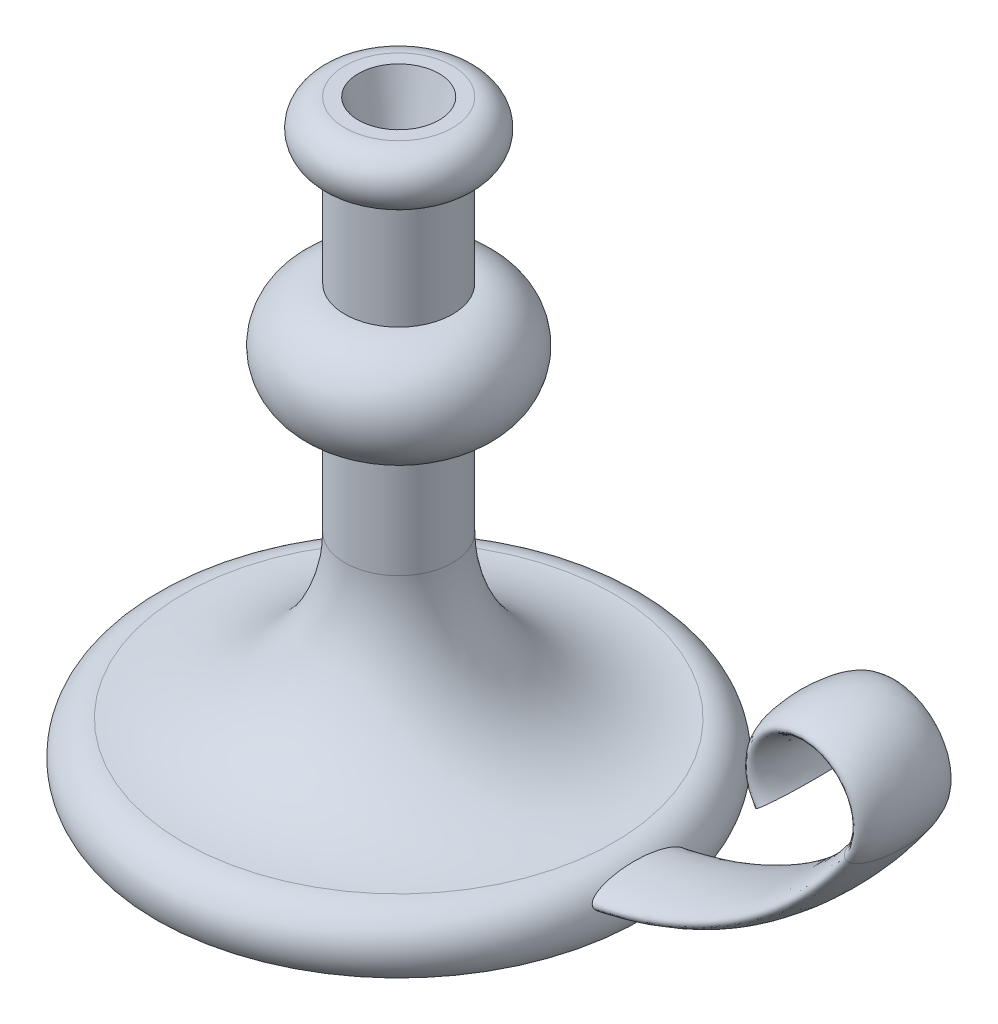
ISO-10303-21;
HEADER;
FILE_DESCRIPTION(('STEP AP214'),'2;1');
FILE_NAME('part.step','',(''),(''),'','','');
FILE_SCHEMA(('AUTOMOTIVE_DESIGN { 1 0 10303 214 1 1 1 1 }'));
ENDSEC;
DATA;
#1=APPLICATION_CONTEXT('core data for automotive mechanical design processes');
#2=APPLICATION_PROTOCOL_DEFINITION('international standard','automotive_design',2000,#1);
#3=PRODUCT_CONTEXT('',#1,'mechanical');
#4=PRODUCT('Part','Part','',(#3));
#5=PRODUCT_RELATED_PRODUCT_CATEGORY('part','',(#4));
#6=PRODUCT_DEFINITION_FORMATION('','',#4);
#7=PRODUCT_DEFINITION_CONTEXT('part definition',#1,'design');
#8=PRODUCT_DEFINITION('design','',#6,#7);
#9=PRODUCT_DEFINITION_SHAPE('','',#8);
#10=(LENGTH_UNIT() NAMED_UNIT(*) SI_UNIT(.MILLI.,.METRE.));
#11=(NAMED_UNIT(*) PLANE_ANGLE_UNIT() SI_UNIT($,.RADIAN.));
#12=(NAMED_UNIT(*) SI_UNIT($,.STERADIAN.) SOLID_ANGLE_UNIT());
#13=UNCERTAINTY_MEASURE_WITH_UNIT(LENGTH_MEASURE(1.E-05),#10,'distance_accuracy_value','');
#14=(GEOMETRIC_REPRESENTATION_CONTEXT(3) GLOBAL_UNCERTAINTY_ASSIGNED_CONTEXT((#13)) GLOBAL_UNIT_ASSIGNED_CONTEXT((#10,
#11,#12)) REPRESENTATION_CONTEXT('',''));
#15=CARTESIAN_POINT('',(0.,0.,0.));
#16=DIRECTION('',(0.,0.,1.));
#17=DIRECTION('',(1.,0.,0.));
#18=AXIS2_PLACEMENT_3D('',#15,#16,#17);
#19=CARTESIAN_POINT('',(0.,0.,0.));
#20=DIRECTION('',(0.,-1.,0.));
#21=DIRECTION('',(0.,0.,-1.));
#22=AXIS2_PLACEMENT_3D('',#19,#20,#21);
#23=PLANE('',#22);
#24=CARTESIAN_POINT('',(0.,0.,0.));
#25=DIRECTION('',(0.,-1.,0.));
#26=DIRECTION('',(0.,0.,-1.));
#27=AXIS2_PLACEMENT_3D('',#24,#25,#26);
#28=CIRCLE('',#27,90.);
#29=CARTESIAN_POINT('',(0.,0.,-90.));
#30=VERTEX_POINT('',#29);
#31=EDGE_CURVE('E76',#30,#30,#28,.T.);
#32=ORIENTED_EDGE('',*,*,#31,.T.);
#33=EDGE_LOOP('',(#32));
#34=FACE_BOUND('',#33,.T.);
#35=ADVANCED_FACE('F36',(#34),#23,.T.);
#36=CARTESIAN_POINT('',(0.,220.,0.));
#37=DIRECTION('',(0.,1.,0.));
#38=DIRECTION('',(0.,0.,1.));
#39=AXIS2_PLACEMENT_3D('',#36,#37,#38);
#40=PLANE('',#39);
#41=CARTESIAN_POINT('',(0.,220.,0.));
#42=DIRECTION('',(0.,1.,0.));
#43=DIRECTION('',(0.,0.,1.));
#44=AXIS2_PLACEMENT_3D('',#41,#42,#43);
#45=CIRCLE('',#44,15.);
#46=CARTESIAN_POINT('',(0.,220.,15.));
#47=VERTEX_POINT('',#46);
#48=EDGE_CURVE('E92',#47,#47,#45,.T.);
#49=ORIENTED_EDGE('',*,*,#48,.F.);
#50=EDGE_LOOP('',(#49));
#51=FACE_BOUND('',#50,.T.);
#52=CARTESIAN_POINT('',(0.,220.,0.));
#53=DIRECTION('',(0.,-1.,0.));
#54=DIRECTION('',(0.,0.,-1.));
#55=AXIS2_PLACEMENT_3D('',#52,#53,#54);
#56=CIRCLE('',#55,20.);
#57=CARTESIAN_POINT('',(0.,220.,-20.));
#58=VERTEX_POINT('',#57);
#59=EDGE_CURVE('E48',#58,#58,#56,.T.);
#60=ORIENTED_EDGE('',*,*,#59,.F.);
#61=EDGE_LOOP('',(#60));
#62=FACE_BOUND('',#61,.T.);
#63=ADVANCED_FACE('F99',(#51,#62),#40,.T.);
#64=CARTESIAN_POINT('',(0.,210.,0.));
#65=DIRECTION('',(0.,-1.,0.));
#66=DIRECTION('',(0.,0.,-1.));
#67=AXIS2_PLACEMENT_3D('',#64,#65,#66);
#68=TOROIDAL_SURFACE('',#67,20.,10.);
#69=ORIENTED_EDGE('',*,*,#59,.T.);
#70=EDGE_LOOP('',(#69));
#71=FACE_BOUND('',#70,.T.);
#72=CARTESIAN_POINT('',(0.,200.,0.));
#73=DIRECTION('',(0.,-1.,0.));
#74=DIRECTION('',(0.,0.,-1.));
#75=AXIS2_PLACEMENT_3D('',#72,#73,#74);
#76=CIRCLE('',#75,20.);
#77=CARTESIAN_POINT('',(0.,200.,-20.));
#78=VERTEX_POINT('',#77);
#79=EDGE_CURVE('E53',#78,#78,#76,.T.);
#80=ORIENTED_EDGE('',*,*,#79,.F.);
#81=EDGE_LOOP('',(#80));
#82=FACE_BOUND('',#81,.T.);
#83=ADVANCED_FACE('F102',(#71,#82),#68,.T.);
#84=CARTESIAN_POINT('',(0.,0.,0.));
#85=DIRECTION('',(0.,-1.,0.));
#86=DIRECTION('',(0.,0.,-1.));
#87=AXIS2_PLACEMENT_3D('',#84,#85,#86);
#88=CYLINDRICAL_SURFACE('',#87,20.);
#89=ORIENTED_EDGE('',*,*,#79,.T.);
#90=EDGE_LOOP('',(#89));
#91=FACE_BOUND('',#90,.T.);
#92=CARTESIAN_POINT('',(0.,160.,0.));
#93=DIRECTION('',(0.,-1.,0.));
#94=DIRECTION('',(0.,0.,-1.));
#95=AXIS2_PLACEMENT_3D('',#92,#93,#94);
#96=CIRCLE('',#95,20.);
#97=CARTESIAN_POINT('',(0.,160.,-20.));
#98=VERTEX_POINT('',#97);
#99=EDGE_CURVE('E58',#98,#98,#96,.T.);
#100=ORIENTED_EDGE('',*,*,#99,.F.);
#101=EDGE_LOOP('',(#100));
#102=FACE_BOUND('',#101,.T.);
#103=ADVANCED_FACE('F107',(#91,#102),#88,.T.);
#104=CARTESIAN_POINT('',(0.,140.,0.));
#105=DIRECTION('',(0.,-1.,0.));
#106=DIRECTION('',(0.,0.,-1.));
#107=AXIS2_PLACEMENT_3D('',#104,#105,#106);
#108=TOROIDAL_SURFACE('',#107,20.,20.);
#109=ORIENTED_EDGE('',*,*,#99,.T.);
#110=EDGE_LOOP('',(#109));
#111=FACE_BOUND('',#110,.T.);
#112=CARTESIAN_POINT('',(0.,120.,0.));
#113=DIRECTION('',(0.,-1.,0.));
#114=DIRECTION('',(0.,0.,-1.));
#115=AXIS2_PLACEMENT_3D('',#112,#113,#114);
#116=CIRCLE('',#115,20.);
#117=CARTESIAN_POINT('',(0.,120.,-20.));
#118=VERTEX_POINT('',#117);
#119=EDGE_CURVE('E64',#118,#118,#116,.T.);
#120=ORIENTED_EDGE('',*,*,#119,.F.);
#121=EDGE_LOOP('',(#120));
#122=FACE_BOUND('',#121,.T.);
#123=ADVANCED_FACE('F113',(#111,#122),#108,.T.);
#124=CARTESIAN_POINT('',(0.,0.,0.));
#125=DIRECTION('',(0.,-1.,0.));
#126=DIRECTION('',(0.,0.,-1.));
#127=AXIS2_PLACEMENT_3D('',#124,#125,#126);
#128=CYLINDRICAL_SURFACE('',#127,20.);
#129=ORIENTED_EDGE('',*,*,#119,.T.);
#130=EDGE_LOOP('',(#129));
#131=FACE_BOUND('',#130,.T.);
#132=CARTESIAN_POINT('',(0.,80.,0.));
#133=DIRECTION('',(0.,-1.,0.));
#134=DIRECTION('',(0.,0.,-1.));
#135=AXIS2_PLACEMENT_3D('',#132,#133,#134);
#136=CIRCLE('',#135,20.);
#137=CARTESIAN_POINT('',(0.,80.,-20.));
#138=VERTEX_POINT('',#137);
#139=EDGE_CURVE('E68',#138,#138,#136,.T.);
#140=ORIENTED_EDGE('',*,*,#139,.F.);
#141=EDGE_LOOP('',(#140));
#142=FACE_BOUND('',#141,.T.);
#143=ADVANCED_FACE('F117',(#131,#142),#128,.T.);
#144=CARTESIAN_POINT('',(0.,80.,0.));
#145=DIRECTION('',(0.,-1.,0.));
#146=DIRECTION('',(0.,0.,-1.));
#147=AXIS2_PLACEMENT_3D('',#144,#145,#146);
#148=TOROIDAL_SURFACE('',#147,80.,60.);
#149=ORIENTED_EDGE('',*,*,#139,.T.);
#150=EDGE_LOOP('',(#149));
#151=FACE_BOUND('',#150,.T.);
#152=CARTESIAN_POINT('',(0.,20.,0.));
#153=DIRECTION('',(0.,-1.,0.));
#154=DIRECTION('',(0.,0.,-1.));
#155=AXIS2_PLACEMENT_3D('',#152,#153,#154);
#156=CIRCLE('',#155,80.);
#157=CARTESIAN_POINT('',(0.,20.,-80.));
#158=VERTEX_POINT('',#157);
#159=EDGE_CURVE('E72',#158,#158,#156,.T.);
#160=ORIENTED_EDGE('',*,*,#159,.F.);
#161=EDGE_LOOP('',(#160));
#162=FACE_BOUND('',#161,.T.);
#163=ADVANCED_FACE('F121',(#151,#162),#148,.F.);
#164=CARTESIAN_POINT('',(0.,7.50000000000001,0.));
#165=DIRECTION('',(0.,-1.,0.));
#166=DIRECTION('',(0.,0.,-1.));
#167=AXIS2_PLACEMENT_3D('',#164,#165,#166);
#168=TOROIDAL_SURFACE('',#167,80.,12.5);
#169=CARTESIAN_POINT('',(89.5597422043342,12.9414346567555,-17.5));
#170=CARTESIAN_POINT('',(89.5390618403562,12.9834100865228,-17.4999996776707));
#171=CARTESIAN_POINT('',(89.518481763466,13.0254349004937,-17.4978446678338));
#172=CARTESIAN_POINT('',(89.4776811982744,13.1092324497794,-17.4892861575811));
#173=CARTESIAN_POINT('',(89.4574608430711,13.151005088161,-17.4828811168849));
#174=CARTESIAN_POINT('',(89.397540281121,13.2754779151414,-17.4575154450276));
#175=CARTESIAN_POINT('',(89.3585808220613,13.357332519418,-17.4324042670614));
#176=CARTESIAN_POINT('',(89.2734407804368,13.5379179993389,-17.3597430943198));
#177=CARTESIAN_POINT('',(89.2281116968574,13.6353152430682,-17.3079906529225));
#178=CARTESIAN_POINT('',(89.1421567137609,13.8217570109409,-17.1881654215547));
#179=CARTESIAN_POINT('',(89.10154096816,13.9107834263931,-17.1200583326704));
#180=CARTESIAN_POINT('',(89.0298799325304,14.0690063055582,-16.9825317839868));
#181=CARTESIAN_POINT('',(88.9982856031081,14.1392491335226,-16.9145677994464));
#182=CARTESIAN_POINT('',(88.9378435588022,14.2742914925202,-16.7722502997375));
#183=CARTESIAN_POINT('',(88.9089980734782,14.3390866000317,-16.6978916893925));
#184=CARTESIAN_POINT('',(88.8536099995594,14.4639626152392,-16.5442177801531));
#185=CARTESIAN_POINT('',(88.8270733532937,14.5240313225779,-16.4648905452803));
#186=CARTESIAN_POINT('',(88.7760376587064,14.6398576639347,-16.3025863942461));
#187=CARTESIAN_POINT('',(88.7515379613228,14.6956166708123,-16.2196106536441));
#188=CARTESIAN_POINT('',(88.704732820549,14.8023169553036,-16.052427362784));
#189=CARTESIAN_POINT('',(88.6823939519366,14.8533308765833,-15.9682752160745));
#190=CARTESIAN_POINT('',(88.639155365759,14.9521540950118,-15.797741621076));
#191=CARTESIAN_POINT('',(88.6182558899722,14.9999628537458,-15.711359801597));
#192=CARTESIAN_POINT('',(88.5573681790009,15.1392585624723,-15.4492483073625));
#193=CARTESIAN_POINT('',(88.5192579811328,15.2264609786254,-15.2707999543232));
#194=CARTESIAN_POINT('',(88.4468979005837,15.3916731276291,-14.9088289385944));
#195=CARTESIAN_POINT('',(88.4126513155027,15.4696750103546,-14.725302105289));
#196=CARTESIAN_POINT('',(88.347139159504,15.6182965032922,-14.3538259785736));
#197=CARTESIAN_POINT('',(88.3158872528146,15.6888824046965,-14.1658608782527));
#198=CARTESIAN_POINT('',(88.2560127035516,15.8233792512431,-13.787400391854));
#199=CARTESIAN_POINT('',(88.2273872233003,15.8872974109117,-13.5969079973402));
#200=CARTESIAN_POINT('',(88.1723348827449,16.0094159388249,-13.213849673779));
#201=CARTESIAN_POINT('',(88.1459074726896,16.06761773743,-13.021284276893));
#202=CARTESIAN_POINT('',(88.0884248304702,16.1932687928886,-12.5849658119247));
#203=CARTESIAN_POINT('',(88.0579162002184,16.2592725226906,-12.3407253521734));
#204=CARTESIAN_POINT('',(87.9994625659014,16.3844358500305,-11.8501803460781));
#205=CARTESIAN_POINT('',(87.9715178234089,16.4435947494061,-11.6038755919222));
#206=CARTESIAN_POINT('',(87.9178897421858,16.5558889779776,-11.1095299870479));
#207=CARTESIAN_POINT('',(87.8922075114269,16.6090213595568,-10.86148834924));
#208=CARTESIAN_POINT('',(87.8429155378604,16.7098546386226,-10.3640943607018));
#209=CARTESIAN_POINT('',(87.8193058942812,16.7575552760878,-10.1147419478211));
#210=CARTESIAN_POINT('',(87.7514718906047,16.8930622945828,-9.36631396644903));
#211=CARTESIAN_POINT('',(87.7101114199141,16.97354616682,-8.86564202060318));
#212=CARTESIAN_POINT('',(87.6344118706354,17.1178657179368,-7.86153551840233));
#213=CARTESIAN_POINT('',(87.600071334108,17.1817048544489,-7.35810155802569));
#214=CARTESIAN_POINT('',(87.5383679228555,17.2943697092707,-6.35225136111879));
#215=CARTESIAN_POINT('',(87.5109639050819,17.3432843238913,-5.84984753787561));
#216=CARTESIAN_POINT('',(87.4628391630612,17.4279603163538,-4.84354228831016));
#217=CARTESIAN_POINT('',(87.4421195253373,17.4637195559667,-4.33964063194095));
#218=CARTESIAN_POINT('',(87.4074386787955,17.5229738360404,-3.33084363886018));
#219=CARTESIAN_POINT('',(87.3934780874882,17.5464677559495,-2.82594821558686));
#220=CARTESIAN_POINT('',(87.3724154174236,17.5817273168609,-1.81615213380807));
#221=CARTESIAN_POINT('',(87.3653059747339,17.5935055508652,-1.31125206554525));
#222=CARTESIAN_POINT('',(87.3579750479625,17.6056484066489,-0.301318309132948));
#223=CARTESIAN_POINT('',(87.3577528582351,17.6060141977103,0.203715360026052));
#224=CARTESIAN_POINT('',(87.3641963426439,17.5953454261038,1.21356726554166));
#225=CARTESIAN_POINT('',(87.3708612610896,17.5843121142068,1.71838551945505));
#226=CARTESIAN_POINT('',(87.3886163883338,17.554616306541,2.6069506864985));
#227=CARTESIAN_POINT('',(87.3982690399213,17.5384060734754,2.99081046478837));
#228=CARTESIAN_POINT('',(87.421496688066,17.4990063104014,3.7580700278571));
#229=CARTESIAN_POINT('',(87.4350718235981,17.4758165331044,4.14146979585427));
#230=CARTESIAN_POINT('',(87.4661109016122,17.4221255760208,4.90767543763209));
#231=CARTESIAN_POINT('',(87.4835755913649,17.3916229911934,5.2904811830376));
#232=CARTESIAN_POINT('',(87.52247652696,17.3226675403927,6.05728766608038));
#233=CARTESIAN_POINT('',(87.5439339089184,17.2841722314846,6.44128353835444));
#234=CARTESIAN_POINT('',(87.5907685418078,17.1987228636429,7.20803081067561));
#235=CARTESIAN_POINT('',(87.6161451191906,17.1517702579396,7.59078241304235));
#236=CARTESIAN_POINT('',(87.6708875244929,17.0486132676472,8.35453102594121));
#237=CARTESIAN_POINT('',(87.7002509792864,16.9924143825779,8.73552894189142));
#238=CARTESIAN_POINT('',(87.7555693385742,16.8844873931684,9.40362807317353));
#239=CARTESIAN_POINT('',(87.7806318626291,16.8349635590468,9.6911595586557));
#240=CARTESIAN_POINT('',(87.8333287645208,16.7293167465828,10.2648242071224));
#241=CARTESIAN_POINT('',(87.8609635304672,16.6731927720484,10.5509571522123));
#242=CARTESIAN_POINT('',(87.9190678138249,16.5534902310351,11.1217112831613));
#243=CARTESIAN_POINT('',(87.9495404231884,16.4899035134825,11.4063304543326));
#244=CARTESIAN_POINT('',(88.0137266324376,16.3541216812726,11.9738772339478));
#245=CARTESIAN_POINT('',(88.0474477220508,16.2819065762201,12.2567992545899));
#246=CARTESIAN_POINT('',(88.1183718381954,16.1280994435203,12.817582109759));
#247=CARTESIAN_POINT('',(88.1555499028384,16.0465737963569,13.0954641920684));
#248=CARTESIAN_POINT('',(88.2343580118385,15.8719007074313,13.6468218234689));
#249=CARTESIAN_POINT('',(88.2759857295859,15.7787593350284,13.9202995902184));
#250=CARTESIAN_POINT('',(88.342656822394,15.6283840406489,14.3254052817093));
#251=CARTESIAN_POINT('',(88.3655500017785,15.5765627213431,14.4594023169282));
#252=CARTESIAN_POINT('',(88.4129882653633,15.4688611687534,14.7254525655377));
#253=CARTESIAN_POINT('',(88.4375331689951,15.4129813790935,14.8575059894889));
#254=CARTESIAN_POINT('',(88.4884967907573,15.2967269720349,15.1188747284345));
#255=CARTESIAN_POINT('',(88.5149109123159,15.2363633637365,15.2481958098581));
#256=CARTESIAN_POINT('',(88.5700241751772,15.110317900121,15.5037035642083));
#257=CARTESIAN_POINT('',(88.5987227483178,15.0446373670988,15.6298910063175));
#258=CARTESIAN_POINT('',(88.6570151826479,14.9113179601608,15.8704199707061));
#259=CARTESIAN_POINT('',(88.6864417367861,14.8440563407288,15.9850095995262));
#260=CARTESIAN_POINT('',(88.7482816567769,14.7030103830825,16.2094581395954));
#261=CARTESIAN_POINT('',(88.7806974756142,14.629220689998,16.319313055117));
#262=CARTESIAN_POINT('',(88.8489097184973,14.474563961653,16.5315146626625));
#263=CARTESIAN_POINT('',(88.8846785573509,14.393755019161,16.6339121024917));
#264=CARTESIAN_POINT('',(88.9606113704154,14.2232561160765,16.8291907541923));
#265=CARTESIAN_POINT('',(89.0007675950254,14.1335818404864,16.9220882016583));
#266=CARTESIAN_POINT('',(89.0601235459873,14.0021924630804,17.0411637727685));
#267=CARTESIAN_POINT('',(89.0770574086406,13.9648250339926,17.073294917827));
#268=CARTESIAN_POINT('',(89.111770404309,13.8885105828122,17.1351129203989));
#269=CARTESIAN_POINT('',(89.1295494801999,13.8495636674961,17.1647999427302));
#270=CARTESIAN_POINT('',(89.1842722230348,13.7301865324197,17.2496672583031));
#271=CARTESIAN_POINT('',(89.2225929343976,13.6472387371286,17.3006362954167));
#272=CARTESIAN_POINT('',(89.2830198855205,13.5177923286575,17.3659392171785));
#273=CARTESIAN_POINT('',(89.3038035106326,13.473489983239,17.385944655127));
#274=CARTESIAN_POINT('',(89.3462357272131,13.3835498526411,17.421521231844));
#275=CARTESIAN_POINT('',(89.3678838017236,13.3379128698457,17.4370949768748));
#276=CARTESIAN_POINT('',(89.411904802424,13.2456714845447,17.4633118273199));
#277=CARTESIAN_POINT('',(89.4342765183817,13.1990687398023,17.4739627514633));
#278=CARTESIAN_POINT('',(89.4796070415907,13.1052444737536,17.4900003628641));
#279=CARTESIAN_POINT('',(89.5025657624808,13.0580230439622,17.495387819971));
#280=CARTESIAN_POINT('',(89.5464271716018,12.9684112208444,17.5004320668286));
#281=CARTESIAN_POINT('',(89.5672934245652,12.9260327119425,17.5006298436875));
#282=CARTESIAN_POINT('',(89.6091580078857,12.8415284156483,17.496667300483));
#283=CARTESIAN_POINT('',(89.6301563797469,12.799402716722,17.4925055351934));
#284=CARTESIAN_POINT('',(89.6721156351431,12.7157496198107,17.479965082583));
#285=CARTESIAN_POINT('',(89.6930765014329,12.6742224548788,17.4715847960013));
#286=CARTESIAN_POINT('',(89.7348115258835,12.5920532516238,17.450862522026));
#287=CARTESIAN_POINT('',(89.7555855765781,12.5514117057388,17.4385183877269));
#288=CARTESIAN_POINT('',(89.8013847331777,12.4623676182576,17.4070626989759));
#289=CARTESIAN_POINT('',(89.8263321178974,12.4142402057078,17.3870577635768));
#290=CARTESIAN_POINT('',(89.8756026524763,12.3198942829529,17.3423007335127));
#291=CARTESIAN_POINT('',(89.8999253272692,12.2736772101063,17.317545140678));
#292=CARTESIAN_POINT('',(89.9718636752115,12.1379719567038,17.2371059859824));
#293=CARTESIAN_POINT('',(90.0184026508769,12.0515209207989,17.1752845379973));
#294=CARTESIAN_POINT('',(90.1015176697338,11.8991704299986,17.0502729237444));
#295=CARTESIAN_POINT('',(90.1385373685485,11.8321383297489,16.9886971231213));
#296=CARTESIAN_POINT('',(90.2104869329279,11.7032426034951,16.8591573255862));
#297=CARTESIAN_POINT('',(90.24541514088,11.6413830620089,16.7911883686367));
#298=CARTESIAN_POINT('',(90.3133841124365,11.5222099067342,16.6502911436157));
#299=CARTESIAN_POINT('',(90.3464212107125,11.4649050425,16.577353807455));
#300=CARTESIAN_POINT('',(90.4107258034175,11.3544143267812,16.4277349965839));
#301=CARTESIAN_POINT('',(90.441993749758,11.3012274221162,16.3510544874357));
#302=CARTESIAN_POINT('',(90.5066142435689,11.1922810586096,16.1853189525369));
#303=CARTESIAN_POINT('',(90.5397652495639,11.1369814833085,16.095884783533));
#304=CARTESIAN_POINT('',(90.6043042941242,11.0303194621557,15.9140859303205));
#305=CARTESIAN_POINT('',(90.6356921559876,10.9789574107339,15.8217209538335));
#306=CARTESIAN_POINT('',(90.6968383877971,10.879769884165,15.6347974994412));
#307=CARTESIAN_POINT('',(90.7265992701637,10.8319389137697,15.5402427441419));
#308=CARTESIAN_POINT('',(90.7846969346252,10.739329513768,15.3492353522604));
#309=CARTESIAN_POINT('',(90.8130337948204,10.6945509167066,15.2527828201662));
#310=CARTESIAN_POINT('',(90.877121220524,10.5940589597548,15.0277319837681));
#311=CARTESIAN_POINT('',(90.9124022819658,10.5393328792864,14.898559344014));
#312=CARTESIAN_POINT('',(90.9809741103802,10.4339610325183,14.6380328432607));
#313=CARTESIAN_POINT('',(91.0142645951403,10.3833158444316,14.5066786763345));
#314=CARTESIAN_POINT('',(91.1115171918213,10.2366440116076,14.1096810918778));
#315=CARTESIAN_POINT('',(91.1727828792967,10.1460018602113,13.8413800425916));
#316=CARTESIAN_POINT('',(91.289286281246,9.97615455726903,13.2997906638456));
#317=CARTESIAN_POINT('',(91.3445203789088,9.89695625887026,13.0264994554533));
#318=CARTESIAN_POINT('',(91.449980571998,9.74769654866254,12.4748594155945));
#319=CARTESIAN_POINT('',(91.5001780442573,9.67768673078008,12.1964912536694));
#320=CARTESIAN_POINT('',(91.5957501918068,9.54592534416377,11.637239342574));
#321=CARTESIAN_POINT('',(91.6411285723794,9.48416742117619,11.3563577087902));
#322=CARTESIAN_POINT('',(91.7275132616964,9.36779787162538,10.7925089006671));
#323=CARTESIAN_POINT('',(91.768520272942,9.31318509647913,10.5095420692677));
#324=CARTESIAN_POINT('',(91.8503345045437,9.20520508711796,9.91387150213544));
#325=CARTESIAN_POINT('',(91.8907217744488,9.15249390095802,9.60099168323523));
#326=CARTESIAN_POINT('',(91.966921819911,9.05389158705524,8.97359688181857));
#327=CARTESIAN_POINT('',(92.0027343661631,9.0080008011613,8.6590818181583));
#328=CARTESIAN_POINT('',(92.0700329889401,8.92240020575299,8.02865568808662));
#329=CARTESIAN_POINT('',(92.101517751625,8.88269227276188,7.71274422766376));
#330=CARTESIAN_POINT('',(92.1603325838503,8.80898713679298,7.07986626810491));
#331=CARTESIAN_POINT('',(92.1876625005419,8.77499014390493,6.76289973059278));
#332=CARTESIAN_POINT('',(92.263503001365,8.68114273902091,5.81249868362111));
#333=CARTESIAN_POINT('',(92.3060517448553,8.62919999492185,5.17778747193733));
#334=CARTESIAN_POINT('',(92.3760091017524,8.54431318450684,3.90627938186708));
#335=CARTESIAN_POINT('',(92.4034169750228,8.51137004695182,3.26948240305168));
#336=CARTESIAN_POINT('',(92.4435085691827,8.46331702284114,1.99545741778321));
#337=CARTESIAN_POINT('',(92.4562084043365,8.44818761908843,1.35823064985294));
#338=CARTESIAN_POINT('',(92.4671302630246,8.43517103988549,0.0834423270802394));
#339=CARTESIAN_POINT('',(92.4653514271759,8.4372848879103,-0.554119245388646));
#340=CARTESIAN_POINT('',(92.4472853754492,8.45883344750921,-1.82886328297049));
#341=CARTESIAN_POINT('',(92.4309954438924,8.47827140120327,-2.46604565478163));
#342=CARTESIAN_POINT('',(92.3836590626409,8.53514174464794,-3.73902583867075));
#343=CARTESIAN_POINT('',(92.3526140808133,8.57257234445222,-4.37482378215577));
#344=CARTESIAN_POINT('',(92.2921790866403,8.64621329194999,-5.36625544461051));
#345=CARTESIAN_POINT('',(92.2680118235608,8.67578736963483,-5.72271555901935));
#346=CARTESIAN_POINT('',(92.2147013952354,8.74146404735393,-6.4346581960336));
#347=CARTESIAN_POINT('',(92.1855583836333,8.7775664458054,-6.79014074848037));
#348=CARTESIAN_POINT('',(92.1221127048893,8.85679311513353,-7.49983836059533));
#349=CARTESIAN_POINT('',(92.0878103957548,8.89991689880826,-7.85405350646513));
#350=CARTESIAN_POINT('',(92.013798122625,8.99384143269652,-8.56089767223962));
#351=CARTESIAN_POINT('',(91.9740883343957,9.04464193338983,-8.91352674331382));
#352=CARTESIAN_POINT('',(91.9015818240063,9.13842562293719,-9.51226790233151));
#353=CARTESIAN_POINT('',(91.870237065407,9.17924629619438,-9.75889575934236));
#354=CARTESIAN_POINT('',(91.8045624920057,9.26550036635915,-10.2509419620306));
#355=CARTESIAN_POINT('',(91.770232756707,9.31093364041772,-10.4963603397379));
#356=CARTESIAN_POINT('',(91.6984266463271,9.40685898724884,-10.9855805665739));
#357=CARTESIAN_POINT('',(91.6609523533816,9.45734771681969,-11.229383371817));
#358=CARTESIAN_POINT('',(91.5826038967891,9.56401317099029,-11.7151775621051));
#359=CARTESIAN_POINT('',(91.5417298772535,9.62018965451317,-11.9571690234578));
#360=CARTESIAN_POINT('',(91.4386423376745,9.76351210996386,-12.5384162018487));
#361=CARTESIAN_POINT('',(91.3745858903287,9.85386844470749,-12.8765786557774));
#362=CARTESIAN_POINT('',(91.2720163238266,10.0014015523807,-13.3793136041314));
#363=CARTESIAN_POINT('',(91.2367090969992,10.0526332971694,-13.5462966135009));
#364=CARTESIAN_POINT('',(91.1637294936456,10.1596261841619,-13.8782853379557));
#365=CARTESIAN_POINT('',(91.126057223172,10.2153871233019,-14.0432911413076));
#366=CARTESIAN_POINT('',(91.0448513753996,10.3369382727869,-14.384441669313));
#367=CARTESIAN_POINT('',(91.0010908407915,10.4031767890598,-14.5603739146116));
#368=CARTESIAN_POINT('',(90.9100440331645,10.5428509324199,-14.9085311659833));
#369=CARTESIAN_POINT('',(90.8627565865345,10.6162889577864,-15.0807549132316));
#370=CARTESIAN_POINT('',(90.7642492199854,10.7715651970482,-15.4195496037305));
#371=CARTESIAN_POINT('',(90.7130423069866,10.8533759065569,-15.5861368065587));
#372=CARTESIAN_POINT('',(90.6058220172112,11.027534891643,-15.9120386126951));
#373=CARTESIAN_POINT('',(90.5498128203451,11.1198740259081,-16.0713593593325));
#374=CARTESIAN_POINT('',(90.444408289305,11.2969255920342,-16.3465910082042));
#375=CARTESIAN_POINT('',(90.3961277047704,11.3791055101426,-16.4645448336191));
#376=CARTESIAN_POINT('',(90.2950977924847,11.5538633486868,-16.6911566146552));
#377=CARTESIAN_POINT('',(90.2423390562531,11.6464633011954,-16.7997939840168));
#378=CARTESIAN_POINT('',(90.1590440243456,11.7953014200274,-16.9524870890687));
#379=CARTESIAN_POINT('',(90.1303607600847,11.8469859215398,-17.0019977189782));
#380=CARTESIAN_POINT('',(90.0716181087374,11.9538274561511,-17.09631026111));
#381=CARTESIAN_POINT('',(90.0415584049394,12.0089852895525,-17.141111081734));
#382=CARTESIAN_POINT('',(89.9801756575596,12.1227246632091,-17.2246441347399));
#383=CARTESIAN_POINT('',(89.948857753765,12.181292641625,-17.2633984155373));
#384=CARTESIAN_POINT('',(89.8849549671328,12.3020144005062,-17.3335784406432));
#385=CARTESIAN_POINT('',(89.8523712452273,12.3641649194656,-17.3650107233705));
#386=CARTESIAN_POINT('',(89.7981176909033,12.4687258013536,-17.4092508881815));
#387=CARTESIAN_POINT('',(89.7767436177655,12.5101841078546,-17.4246893204628));
#388=CARTESIAN_POINT('',(89.7336969050675,12.5942336377178,-17.4515182330193));
#389=CARTESIAN_POINT('',(89.7120243813912,12.636824427018,-17.4629102408533));
#390=CARTESIAN_POINT('',(89.6685521390583,12.7228207531292,-17.4812886417918));
#391=CARTESIAN_POINT('',(89.6467526103346,12.766225219827,-17.488280453409));
#392=CARTESIAN_POINT('',(89.6031794397247,12.8535466229688,-17.4976362320133));
#393=CARTESIAN_POINT('',(89.5814057970823,12.8974635440191,-17.5000003376542));
#394=CARTESIAN_POINT('',(89.5597422043342,12.9414346567555,-17.5));
#395=B_SPLINE_CURVE_WITH_KNOTS('',3,(#169,#170,#171,#172,#173,#174,#175,#176,#177,#178,#179,
#180,#181,#182,#183,#184,#185,#186,#187,#188,#189,#190,#191,#192,#193,#194,#195,#196,#197,#198,
#199,#200,#201,#202,#203,#204,#205,#206,#207,#208,#209,#210,#211,#212,#213,#214,#215,#216,#217,
#218,#219,#220,#221,#222,#223,#224,#225,#226,#227,#228,#229,#230,#231,#232,#233,#234,#235,#236,
#237,#238,#239,#240,#241,#242,#243,#244,#245,#246,#247,#248,#249,#250,#251,#252,#253,#254,#255,
#256,#257,#258,#259,#260,#261,#262,#263,#264,#265,#266,#267,#268,#269,#270,#271,#272,#273,#274,
#275,#276,#277,#278,#279,#280,#281,#282,#283,#284,#285,#286,#287,#288,#289,#290,#291,#292,#293,
#294,#295,#296,#297,#298,#299,#300,#301,#302,#303,#304,#305,#306,#307,#308,#309,#310,#311,#312,
#313,#314,#315,#316,#317,#318,#319,#320,#321,#322,#323,#324,#325,#326,#327,#328,#329,#330,#331,
#332,#333,#334,#335,#336,#337,#338,#339,#340,#341,#342,#343,#344,#345,#346,#347,#348,#349,#350,
#351,#352,#353,#354,#355,#356,#357,#358,#359,#360,#361,#362,#363,#364,#365,#366,#367,#368,#369,
#370,#371,#372,#373,#374,#375,#376,#377,#378,#379,#380,#381,#382,#383,#384,#385,#386,#387,#388,
#389,#390,#391,#392,#393,#394),.UNSPECIFIED.,.T.,.F.,(4,2,2,2,2,2,2,2,2,2,2,2,2,2,2,2,2,2,2,2,2,
2,2,2,2,2,2,2,2,2,2,2,2,2,2,2,2,2,2,2,2,2,2,2,2,2,2,2,2,2,2,2,2,2,2,2,2,2,2,2,2,2,2,2,2,2,2,2,2,
2,2,2,2,2,2,2,2,2,2,2,2,2,2,2,2,2,2,2,2,2,2,2,2,2,2,2,2,2,2,2,2,2,2,2,2,2,2,2,2,2,2,2,4),(0.,
0.14032687964933,0.280704643844337,0.561461806499993,0.917225717585855,1.2737423538609,
1.58146302398151,1.88943119593645,2.19816989275479,2.50680983170029,2.80944292372752,
3.1121267264326,3.71838915770196,4.32516518168249,4.93458970782545,5.54334784093538,
6.15195325906649,6.91631911029045,7.68076285707087,8.44557890144725,9.21043154271129,
10.7363530227227,12.2619572680851,13.7782885580523,15.2948661984783,16.8115823682402,
18.3266664767785,19.8415953542035,21.3563580231468,22.5092504482308,23.6621837256809,
24.8153386988898,25.9747813799631,27.1340250219355,28.2925816429426,29.1710242088839,
30.0495995331115,30.9291435591543,31.8107663507035,32.6864555684209,33.5616891298977,
33.9980703124479,34.4344038665405,34.8696994156048,35.3048870393032,35.7129485465615,
36.1213479397354,36.5266413619586,36.9312301321631,37.0874810726012,37.2437214677039,
37.556282943945,37.7147148343192,37.8730533580127,38.0311395270884,38.1892025705742,
38.3307149014329,38.4722741597124,38.6138871242242,38.7555769191152,38.9286541005773,
39.1018592207182,39.448590135234,39.7429975955387,40.0376353818192,40.3328261359408,
40.6279411430423,40.9585479808936,41.2891878931731,41.6193018978018,41.9493977775692,
42.3832551508602,42.8171738887972,43.6859467918771,44.5552378220705,45.4292182663367,
46.3025217875285,47.1756847521817,48.1351081860338,49.0945796914528,50.0543418354868,
51.0141392787941,52.9283366636019,54.8426276125093,56.7548192562821,58.6671243992173,
60.5797874956875,62.4922603557708,63.5676819321858,64.6430703071883,65.7183840946035,
66.7936629380631,67.549430316061,68.3051775707197,69.0604283053782,69.8156470419358,
70.8826765887356,71.4172057561802,71.9517109715332,72.530589486173,73.1096614946436,
73.6868888443996,74.2636187787015,74.7180950553378,75.1735510009091,75.4046853668803,
75.6358731855897,75.8661972266867,76.0963147970919,76.2435550398536,76.3907396389803,
76.5377426347989,76.6847412260987),.UNSPECIFIED.);
#396=CARTESIAN_POINT('',(89.5597422043342,12.9414346567555,-17.5));
#397=VERTEX_POINT('',#396);
#398=EDGE_CURVE('E10',#397,#397,#395,.T.);
#399=ORIENTED_EDGE('',*,*,#398,.F.);
#400=EDGE_LOOP('',(#399));
#401=FACE_BOUND('',#400,.T.);
#402=ORIENTED_EDGE('',*,*,#159,.T.);
#403=EDGE_LOOP('',(#402));
#404=FACE_BOUND('',#403,.T.);
#405=ORIENTED_EDGE('',*,*,#31,.F.);
#406=EDGE_LOOP('',(#405));
#407=FACE_BOUND('',#406,.T.);
#408=ADVANCED_FACE('F124',(#401,#404,#407),#168,.T.);
#409=CARTESIAN_POINT('',(150.634185358261,75.,0.));
#410=DIRECTION('',(0.566666666666667,-0.823947139620552,0.));
#411=DIRECTION('',(0.,0.,-1.));
#412=AXIS2_PLACEMENT_3D('',#409,#410,#411);
#413=PLANE('',#412);
#414=CARTESIAN_POINT('',(150.634185358261,75.,0.));
#415=DIRECTION('',(0.566666666666667,-0.823947139620552,0.));
#416=DIRECTION('',(0.,0.,-1.));
#417=AXIS2_PLACEMENT_3D('',#414,#415,#416);
#418=ELLIPSE('',#417,17.5,5.);
#419=CARTESIAN_POINT('',(150.634185358261,75.,-17.5));
#420=VERTEX_POINT('',#419);
#421=EDGE_CURVE('E80',#420,#420,#418,.T.);
#422=ORIENTED_EDGE('',*,*,#421,.T.);
#423=EDGE_LOOP('',(#422));
#424=FACE_BOUND('',#423,.T.);
#425=ADVANCED_FACE('F129',(#424),#413,.T.);
#426=CARTESIAN_POINT('',(60.,9.99999999999999,-17.5));
#427=CARTESIAN_POINT('',(110.410191303973,9.99999999999998,-17.5));
#428=CARTESIAN_POINT('',(155.026295870831,33.4646670673664,-17.5));
#429=CARTESIAN_POINT('',(183.592070943083,74.9999999999999,-17.5));
#430=CARTESIAN_POINT('',(60.,20.,-17.5));
#431=CARTESIAN_POINT('',(107.049511883708,20.,-17.5));
#432=CARTESIAN_POINT('',(148.691209479443,41.900355929542,-17.5));
#433=CARTESIAN_POINT('',(175.352599546877,80.6666666666666,-17.5));
#434=CARTESIAN_POINT('',(60.,20.,17.5));
#435=CARTESIAN_POINT('',(107.049511883708,20.,17.5));
#436=CARTESIAN_POINT('',(148.691209479443,41.900355929542,17.5));
#437=CARTESIAN_POINT('',(175.352599546877,80.6666666666666,17.5));
#438=CARTESIAN_POINT('',(60.,9.99999999999999,17.5));
#439=CARTESIAN_POINT('',(110.410191303973,9.99999999999998,17.5));
#440=CARTESIAN_POINT('',(155.026295870831,33.4646670673664,17.5));
#441=CARTESIAN_POINT('',(183.592070943083,74.9999999999999,17.5));
#442=CARTESIAN_POINT('',(60.,0.,17.5));
#443=CARTESIAN_POINT('',(113.770870724238,0.,17.5));
#444=CARTESIAN_POINT('',(161.36138226222,25.0289782051909,17.5));
#445=CARTESIAN_POINT('',(191.831542339288,69.3333333333332,17.5));
#446=CARTESIAN_POINT('',(60.,0.,-17.5));
#447=CARTESIAN_POINT('',(113.770870724238,0.,-17.5));
#448=CARTESIAN_POINT('',(161.36138226222,25.0289782051909,-17.5));
#449=CARTESIAN_POINT('',(191.831542339288,69.3333333333332,-17.5));
#450=CARTESIAN_POINT('',(60.,9.99999999999999,-17.5));
#451=CARTESIAN_POINT('',(110.410191303973,9.99999999999998,-17.5));
#452=CARTESIAN_POINT('',(155.026295870831,33.4646670673664,-17.5));
#453=CARTESIAN_POINT('',(183.592070943083,74.9999999999999,-17.5));
#454=(BOUNDED_SURFACE() B_SPLINE_SURFACE(3,3,((#426,#427,#428,#429),(#430,#431,#432,#433),(#434,
#435,#436,#437),(#438,#439,#440,#441),(#442,#443,#444,#445),(#446,#447,#448,#449),(#450,#451,
#452,#453)),.UNSPECIFIED.,.T.,.F.,.F.) B_SPLINE_SURFACE_WITH_KNOTS((4,3,4),(4,4),(0.,0.5,1.),
(0.,1.),.UNSPECIFIED.) GEOMETRIC_REPRESENTATION_ITEM() RATIONAL_B_SPLINE_SURFACE(((1.,
0.923374135437856,0.923374135437856,1.),(0.333333333333333,0.307791378479285,0.307791378479285,
0.333333333333333),(0.333333333333333,0.307791378479285,0.307791378479285,0.333333333333333),
(1.,0.923374135437856,0.923374135437856,1.),(0.333333333333333,0.307791378479285,
0.307791378479285,0.333333333333333),(0.333333333333333,0.307791378479285,0.307791378479285,
0.333333333333333),(1.,0.923374135437856,0.923374135437856,1.))) REPRESENTATION_ITEM('') SURFACE());
#455=CARTESIAN_POINT('',(183.592070943083,75.,0.));
#456=DIRECTION('',(0.566666666666667,0.823947139620552,0.));
#457=DIRECTION('',(0.,0.,-1.));
#458=AXIS2_PLACEMENT_3D('',#455,#456,#457);
#459=ELLIPSE('',#458,17.5,5.);
#460=CARTESIAN_POINT('',(183.592070943083,75.,-17.5));
#461=VERTEX_POINT('',#460);
#462=EDGE_CURVE('E84',#461,#461,#459,.T.);
#463=ORIENTED_EDGE('',*,*,#398,.T.);
#464=EDGE_LOOP('',(#463));
#465=FACE_BOUND('',#464,.T.);
#466=ORIENTED_EDGE('',*,*,#462,.F.);
#467=EDGE_LOOP('',(#466));
#468=FACE_BOUND('',#467,.T.);
#469=ADVANCED_FACE('F134',(#465,#468),#454,.T.);
#470=CARTESIAN_POINT('',(183.592070943083,75.,-17.5));
#471=CARTESIAN_POINT('',(193.981461744242,90.10642735238,-17.5));
#472=CARTESIAN_POINT('',(185.447347211541,106.333333333333,-17.5));
#473=CARTESIAN_POINT('',(167.113128150672,106.333333333333,-17.5));
#474=CARTESIAN_POINT('',(148.778909089802,106.333333333333,-17.5));
#475=CARTESIAN_POINT('',(140.244794557101,90.1064273523801,-17.5));
#476=CARTESIAN_POINT('',(150.634185358261,75.,-17.5));
#477=CARTESIAN_POINT('',(175.352599546877,80.6666666666667,-17.5));
#478=CARTESIAN_POINT('',(180.547294947457,88.2198803428567,-17.5));
#479=CARTESIAN_POINT('',(176.280237681107,96.3333333333333,-17.5));
#480=CARTESIAN_POINT('',(167.113128150672,96.3333333333333,-17.5));
#481=CARTESIAN_POINT('',(157.946018620237,96.3333333333333,-17.5));
#482=CARTESIAN_POINT('',(153.678961353887,88.2198803428567,-17.5));
#483=CARTESIAN_POINT('',(158.873656754466,80.6666666666667,-17.5));
#484=CARTESIAN_POINT('',(175.352599546877,80.6666666666667,17.5));
#485=CARTESIAN_POINT('',(180.547294947457,88.2198803428567,17.5));
#486=CARTESIAN_POINT('',(176.280237681107,96.3333333333333,17.5));
#487=CARTESIAN_POINT('',(167.113128150672,96.3333333333333,17.5));
#488=CARTESIAN_POINT('',(157.946018620237,96.3333333333333,17.5));
#489=CARTESIAN_POINT('',(153.678961353887,88.2198803428567,17.5));
#490=CARTESIAN_POINT('',(158.873656754466,80.6666666666667,17.5));
#491=CARTESIAN_POINT('',(183.592070943083,75.,17.5));
#492=CARTESIAN_POINT('',(193.981461744242,90.10642735238,17.5));
#493=CARTESIAN_POINT('',(185.447347211541,106.333333333333,17.5));
#494=CARTESIAN_POINT('',(167.113128150672,106.333333333333,17.5));
#495=CARTESIAN_POINT('',(148.778909089802,106.333333333333,17.5));
#496=CARTESIAN_POINT('',(140.244794557101,90.1064273523801,17.5));
#497=CARTESIAN_POINT('',(150.634185358261,75.,17.5));
#498=CARTESIAN_POINT('',(191.831542339288,69.3333333333332,17.5));
#499=CARTESIAN_POINT('',(207.415628541027,91.9929743619033,17.5));
#500=CARTESIAN_POINT('',(194.614456741976,116.333333333333,17.5));
#501=CARTESIAN_POINT('',(167.113128150672,116.333333333333,17.5));
#502=CARTESIAN_POINT('',(139.611799559367,116.333333333333,17.5));
#503=CARTESIAN_POINT('',(126.810627760316,91.9929743619035,17.5));
#504=CARTESIAN_POINT('',(142.394713962055,69.3333333333334,17.5));
#505=CARTESIAN_POINT('',(191.831542339288,69.3333333333332,-17.5));
#506=CARTESIAN_POINT('',(207.415628541027,91.9929743619033,-17.5));
#507=CARTESIAN_POINT('',(194.614456741976,116.333333333333,-17.5));
#508=CARTESIAN_POINT('',(167.113128150672,116.333333333333,-17.5));
#509=CARTESIAN_POINT('',(139.611799559367,116.333333333333,-17.5));
#510=CARTESIAN_POINT('',(126.810627760316,91.9929743619035,-17.5));
#511=CARTESIAN_POINT('',(142.394713962055,69.3333333333334,-17.5));
#512=CARTESIAN_POINT('',(183.592070943083,75.,-17.5));
#513=CARTESIAN_POINT('',(193.981461744242,90.10642735238,-17.5));
#514=CARTESIAN_POINT('',(185.447347211541,106.333333333333,-17.5));
#515=CARTESIAN_POINT('',(167.113128150672,106.333333333333,-17.5));
#516=CARTESIAN_POINT('',(148.778909089802,106.333333333333,-17.5));
#517=CARTESIAN_POINT('',(140.244794557101,90.1064273523801,-17.5));
#518=CARTESIAN_POINT('',(150.634185358261,75.,-17.5));
#519=(BOUNDED_SURFACE() B_SPLINE_SURFACE(3,3,((#470,#471,#472,#473,#474,#475,#476),(#477,#478,
#479,#480,#481,#482,#483),(#484,#485,#486,#487,#488,#489,#490),(#491,#492,#493,#494,#495,#496,
#497),(#498,#499,#500,#501,#502,#503,#504),(#505,#506,#507,#508,#509,#510,#511),(#512,#513,#514,
#515,#516,#517,#518)),.UNSPECIFIED.,.T.,.F.,.F.) B_SPLINE_SURFACE_WITH_KNOTS((4,3,4),(4,3,4),
(0.,0.5,1.),(0.,0.5,1.),
.UNSPECIFIED.) GEOMETRIC_REPRESENTATION_ITEM() RATIONAL_B_SPLINE_SURFACE(((1.,0.64364977875042,
0.64364977875042,1.,0.64364977875042,0.64364977875042,1.),(0.333333333333333,0.21454992625014,
0.21454992625014,0.333333333333333,0.21454992625014,0.21454992625014,0.333333333333333),
(0.333333333333333,0.21454992625014,0.21454992625014,0.333333333333333,0.21454992625014,
0.21454992625014,0.333333333333333),(1.,0.64364977875042,0.64364977875042,1.,0.64364977875042,
0.64364977875042,1.),(0.333333333333333,0.21454992625014,0.21454992625014,0.333333333333333,
0.21454992625014,0.21454992625014,0.333333333333333),(0.333333333333333,0.21454992625014,
0.21454992625014,0.333333333333333,0.21454992625014,0.21454992625014,0.333333333333333),(1.,
0.64364977875042,0.64364977875042,1.,0.64364977875042,0.64364977875042,1.))) REPRESENTATION_ITEM('') SURFACE());
#520=ORIENTED_EDGE('',*,*,#421,.F.);
#521=EDGE_LOOP('',(#520));
#522=FACE_BOUND('',#521,.T.);
#523=ORIENTED_EDGE('',*,*,#462,.T.);
#524=EDGE_LOOP('',(#523));
#525=FACE_BOUND('',#524,.T.);
#526=ADVANCED_FACE('F131',(#522,#525),#519,.T.);
#527=CARTESIAN_POINT('',(0.,220.,0.));
#528=DIRECTION('',(0.,1.,0.));
#529=DIRECTION('',(0.,0.,1.));
#530=AXIS2_PLACEMENT_3D('',#527,#528,#529);
#531=CONICAL_SURFACE('',#530,15.,0.26179938779915);
#532=CARTESIAN_POINT('',(0.,195.,0.));
#533=DIRECTION('',(0.,1.,0.));
#534=DIRECTION('',(0.,0.,1.));
#535=AXIS2_PLACEMENT_3D('',#532,#533,#534);
#536=CIRCLE('',#535,8.30127018922192);
#537=CARTESIAN_POINT('',(0.,195.,8.30127018922192));
#538=VERTEX_POINT('',#537);
#539=EDGE_CURVE('E88',#538,#538,#536,.T.);
#540=ORIENTED_EDGE('',*,*,#539,.F.);
#541=EDGE_LOOP('',(#540));
#542=FACE_BOUND('',#541,.T.);
#543=ORIENTED_EDGE('',*,*,#48,.T.);
#544=EDGE_LOOP('',(#543));
#545=FACE_BOUND('',#544,.T.);
#546=ADVANCED_FACE('F97',(#542,#545),#531,.F.);
#547=CARTESIAN_POINT('',(0.,195.,0.));
#548=DIRECTION('',(0.,1.,0.));
#549=DIRECTION('',(0.,0.,1.));
#550=AXIS2_PLACEMENT_3D('',#547,#548,#549);
#551=PLANE('',#550);
#552=ORIENTED_EDGE('',*,*,#539,.T.);
#553=EDGE_LOOP('',(#552));
#554=FACE_BOUND('',#553,.T.);
#555=ADVANCED_FACE('F157',(#554),#551,.T.);
#556=CLOSED_SHELL('',(#35,#63,#83,#103,#123,#143,#163,#408,#425,#469,#526,#546,#555));
#557=MANIFOLD_SOLID_BREP('B2',#556);
#558=ADVANCED_BREP_SHAPE_REPRESENTATION('',(#18,#557),#14);
#559=SHAPE_DEFINITION_REPRESENTATION(#9,#558);
ENDSEC;
END-ISO-10303-21;
